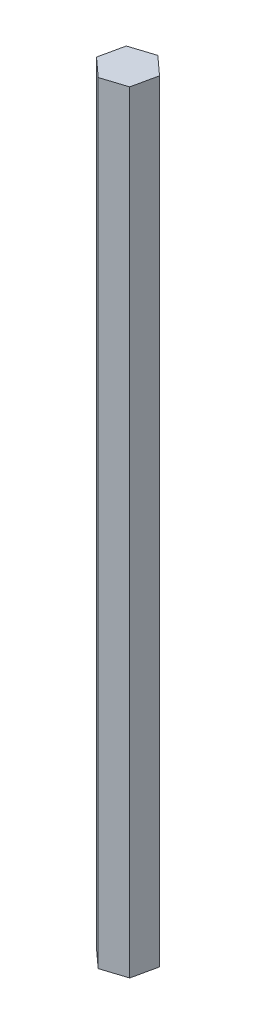
ISO-10303-21;
HEADER;
FILE_DESCRIPTION(('STEP AP214'),'2;1');
FILE_NAME('part.step','',(''),(''),'','','');
FILE_SCHEMA(('AUTOMOTIVE_DESIGN { 1 0 10303 214 1 1 1 1 }'));
ENDSEC;
DATA;
#1=APPLICATION_CONTEXT('core data for automotive mechanical design processes');
#2=APPLICATION_PROTOCOL_DEFINITION('international standard','automotive_design',2000,#1);
#3=PRODUCT_CONTEXT('',#1,'mechanical');
#4=PRODUCT('Part','Part','',(#3));
#5=PRODUCT_RELATED_PRODUCT_CATEGORY('part','',(#4));
#6=PRODUCT_DEFINITION_FORMATION('','',#4);
#7=PRODUCT_DEFINITION_CONTEXT('part definition',#1,'design');
#8=PRODUCT_DEFINITION('design','',#6,#7);
#9=PRODUCT_DEFINITION_SHAPE('','',#8);
#10=(LENGTH_UNIT() NAMED_UNIT(*) SI_UNIT(.MILLI.,.METRE.));
#11=(NAMED_UNIT(*) PLANE_ANGLE_UNIT() SI_UNIT($,.RADIAN.));
#12=(NAMED_UNIT(*) SI_UNIT($,.STERADIAN.) SOLID_ANGLE_UNIT());
#13=UNCERTAINTY_MEASURE_WITH_UNIT(LENGTH_MEASURE(1.E-05),#10,'distance_accuracy_value','');
#14=(GEOMETRIC_REPRESENTATION_CONTEXT(3) GLOBAL_UNCERTAINTY_ASSIGNED_CONTEXT((#13)) GLOBAL_UNIT_ASSIGNED_CONTEXT((#10,
#11,#12)) REPRESENTATION_CONTEXT('',''));
#15=CARTESIAN_POINT('',(0.,0.,0.));
#16=DIRECTION('',(0.,0.,1.));
#17=DIRECTION('',(1.,0.,0.));
#18=AXIS2_PLACEMENT_3D('',#15,#16,#17);
#19=CARTESIAN_POINT('',(-0.61182187926995,127.,2.82117126764399));
#20=DIRECTION('',(-0.305094633460301,0.,-0.952322038300976));
#21=DIRECTION('',(-0.952322038300976,0.,0.305094633460301));
#22=AXIS2_PLACEMENT_3D('',#19,#20,#21);
#23=PLANE('',#22);
#24=DIRECTION('',(-0.952322038300976,0.,0.305094633460301));
#25=VECTOR('',#24,1.);
#26=CARTESIAN_POINT('',(-0.61182187926995,38.1,2.82117126764399));
#27=LINE('',#26,#25);
#28=CARTESIAN_POINT('',(2.13729504657146,38.1,1.94043892386091));
#29=VERTEX_POINT('',#28);
#30=CARTESIAN_POINT('',(-0.61182187926995,38.1,2.82117126764399));
#31=VERTEX_POINT('',#30);
#32=EDGE_CURVE('E53',#29,#31,#27,.T.);
#33=ORIENTED_EDGE('',*,*,#32,.F.);
#34=DIRECTION('',(0.,-1.,0.));
#35=VECTOR('',#34,1.);
#36=CARTESIAN_POINT('',(2.13729504657146,127.,1.94043892386091));
#37=LINE('',#36,#35);
#38=CARTESIAN_POINT('',(2.13729504657146,127.,1.94043892386091));
#39=VERTEX_POINT('',#38);
#40=EDGE_CURVE('E47',#39,#29,#37,.T.);
#41=ORIENTED_EDGE('',*,*,#40,.F.);
#42=DIRECTION('',(0.952322038300976,0.,-0.305094633460301));
#43=VECTOR('',#42,1.);
#44=CARTESIAN_POINT('',(-0.61182187926995,127.,2.82117126764399));
#45=LINE('',#44,#43);
#46=CARTESIAN_POINT('',(-0.61182187926995,127.,2.82117126764399));
#47=VERTEX_POINT('',#46);
#48=EDGE_CURVE('E135',#47,#39,#45,.T.);
#49=ORIENTED_EDGE('',*,*,#48,.F.);
#50=DIRECTION('',(0.,-1.,0.));
#51=VECTOR('',#50,1.);
#52=CARTESIAN_POINT('',(-0.61182187926995,127.,2.82117126764399));
#53=LINE('',#52,#51);
#54=EDGE_CURVE('E109',#47,#31,#53,.T.);
#55=ORIENTED_EDGE('',*,*,#54,.T.);
#56=EDGE_LOOP('',(#33,#41,#49,#55));
#57=FACE_BOUND('',#56,.T.);
#58=ADVANCED_FACE('F39',(#57),#23,.F.);
#59=CARTESIAN_POINT('',(2.13729504657146,127.,1.94043892386091));
#60=DIRECTION('',(-0.977282394482572,0.,-0.211941316015566));
#61=DIRECTION('',(-0.211941316015566,0.,0.977282394482572));
#62=AXIS2_PLACEMENT_3D('',#59,#60,#61);
#63=PLANE('',#62);
#64=DIRECTION('',(-0.211941316015566,0.,0.977282394482572));
#65=VECTOR('',#64,1.);
#66=CARTESIAN_POINT('',(2.13729504657146,38.1,1.94043892386091));
#67=LINE('',#66,#65);
#68=CARTESIAN_POINT('',(2.74911692584142,38.1,-0.880732343783076));
#69=VERTEX_POINT('',#68);
#70=EDGE_CURVE('E131',#69,#29,#67,.T.);
#71=ORIENTED_EDGE('',*,*,#70,.F.);
#72=DIRECTION('',(0.,-1.,0.));
#73=VECTOR('',#72,1.);
#74=CARTESIAN_POINT('',(2.74911692584142,127.,-0.880732343783076));
#75=LINE('',#74,#73);
#76=CARTESIAN_POINT('',(2.74911692584142,127.,-0.880732343783076));
#77=VERTEX_POINT('',#76);
#78=EDGE_CURVE('E121',#77,#69,#75,.T.);
#79=ORIENTED_EDGE('',*,*,#78,.F.);
#80=DIRECTION('',(0.211941316015566,0.,-0.977282394482572));
#81=VECTOR('',#80,1.);
#82=CARTESIAN_POINT('',(2.13729504657146,127.,1.94043892386091));
#83=LINE('',#82,#81);
#84=EDGE_CURVE('E132',#39,#77,#83,.T.);
#85=ORIENTED_EDGE('',*,*,#84,.F.);
#86=ORIENTED_EDGE('',*,*,#40,.T.);
#87=EDGE_LOOP('',(#71,#79,#85,#86));
#88=FACE_BOUND('',#87,.T.);
#89=ADVANCED_FACE('F129',(#88),#63,.F.);
#90=CARTESIAN_POINT('',(2.74911692584142,127.,-0.880732343783076));
#91=DIRECTION('',(-0.672187761022271,0.,0.74038072228541));
#92=DIRECTION('',(0.74038072228541,0.,0.672187761022271));
#93=AXIS2_PLACEMENT_3D('',#90,#91,#92);
#94=PLANE('',#93);
#95=DIRECTION('',(0.74038072228541,0.,0.672187761022271));
#96=VECTOR('',#95,1.);
#97=CARTESIAN_POINT('',(2.74911692584142,38.1,-0.880732343783076));
#98=LINE('',#97,#96);
#99=CARTESIAN_POINT('',(0.611821879269952,38.1,-2.82117126764399));
#100=VERTEX_POINT('',#99);
#101=EDGE_CURVE('E141',#100,#69,#98,.T.);
#102=ORIENTED_EDGE('',*,*,#101,.F.);
#103=DIRECTION('',(0.,-1.,0.));
#104=VECTOR('',#103,1.);
#105=CARTESIAN_POINT('',(0.611821879269952,127.,-2.82117126764399));
#106=LINE('',#105,#104);
#107=CARTESIAN_POINT('',(0.611821879269952,127.,-2.82117126764399));
#108=VERTEX_POINT('',#107);
#109=EDGE_CURVE('E113',#108,#100,#106,.T.);
#110=ORIENTED_EDGE('',*,*,#109,.F.);
#111=DIRECTION('',(-0.74038072228541,0.,-0.672187761022271));
#112=VECTOR('',#111,1.);
#113=CARTESIAN_POINT('',(2.74911692584142,127.,-0.880732343783076));
#114=LINE('',#113,#112);
#115=EDGE_CURVE('E147',#77,#108,#114,.T.);
#116=ORIENTED_EDGE('',*,*,#115,.F.);
#117=ORIENTED_EDGE('',*,*,#78,.T.);
#118=EDGE_LOOP('',(#102,#110,#116,#117));
#119=FACE_BOUND('',#118,.T.);
#120=ADVANCED_FACE('F167',(#119),#94,.F.);
#121=CARTESIAN_POINT('',(0.611821879269952,127.,-2.82117126764399));
#122=DIRECTION('',(0.305094633460301,0.,0.952322038300975));
#123=DIRECTION('',(0.952322038300976,0.,-0.305094633460301));
#124=AXIS2_PLACEMENT_3D('',#121,#122,#123);
#125=PLANE('',#124);
#126=DIRECTION('',(0.952322038300976,0.,-0.305094633460301));
#127=VECTOR('',#126,1.);
#128=CARTESIAN_POINT('',(0.611821879269952,38.1,-2.82117126764399));
#129=LINE('',#128,#127);
#130=CARTESIAN_POINT('',(-2.13729504657146,38.1,-1.94043892386091));
#131=VERTEX_POINT('',#130);
#132=EDGE_CURVE('E105',#131,#100,#129,.T.);
#133=ORIENTED_EDGE('',*,*,#132,.F.);
#134=DIRECTION('',(0.,-1.,0.));
#135=VECTOR('',#134,1.);
#136=CARTESIAN_POINT('',(-2.13729504657146,127.,-1.94043892386091));
#137=LINE('',#136,#135);
#138=CARTESIAN_POINT('',(-2.13729504657146,127.,-1.94043892386091));
#139=VERTEX_POINT('',#138);
#140=EDGE_CURVE('E103',#139,#131,#137,.T.);
#141=ORIENTED_EDGE('',*,*,#140,.F.);
#142=DIRECTION('',(-0.952322038300976,0.,0.305094633460301));
#143=VECTOR('',#142,1.);
#144=CARTESIAN_POINT('',(0.611821879269952,127.,-2.82117126764399));
#145=LINE('',#144,#143);
#146=EDGE_CURVE('E150',#108,#139,#145,.T.);
#147=ORIENTED_EDGE('',*,*,#146,.F.);
#148=ORIENTED_EDGE('',*,*,#109,.T.);
#149=EDGE_LOOP('',(#133,#141,#147,#148));
#150=FACE_BOUND('',#149,.T.);
#151=ADVANCED_FACE('F161',(#150),#125,.F.);
#152=CARTESIAN_POINT('',(-2.13729504657146,127.,-1.94043892386091));
#153=DIRECTION('',(0.977282394482573,0.,0.211941316015565));
#154=DIRECTION('',(0.211941316015565,0.,-0.977282394482573));
#155=AXIS2_PLACEMENT_3D('',#152,#153,#154);
#156=PLANE('',#155);
#157=DIRECTION('',(0.211941316015565,0.,-0.977282394482573));
#158=VECTOR('',#157,1.);
#159=CARTESIAN_POINT('',(-2.13729504657146,38.1,-1.94043892386091));
#160=LINE('',#159,#158);
#161=CARTESIAN_POINT('',(-2.74911692584141,38.1,0.88073234378308));
#162=VERTEX_POINT('',#161);
#163=EDGE_CURVE('E91',#162,#131,#160,.T.);
#164=ORIENTED_EDGE('',*,*,#163,.F.);
#165=DIRECTION('',(0.,-1.,0.));
#166=VECTOR('',#165,1.);
#167=CARTESIAN_POINT('',(-2.74911692584141,127.,0.88073234378308));
#168=LINE('',#167,#166);
#169=CARTESIAN_POINT('',(-2.74911692584141,127.,0.88073234378308));
#170=VERTEX_POINT('',#169);
#171=EDGE_CURVE('E101',#170,#162,#168,.T.);
#172=ORIENTED_EDGE('',*,*,#171,.F.);
#173=DIRECTION('',(-0.211941316015565,0.,0.977282394482572));
#174=VECTOR('',#173,1.);
#175=CARTESIAN_POINT('',(-2.13729504657146,127.,-1.94043892386091));
#176=LINE('',#175,#174);
#177=EDGE_CURVE('E153',#139,#170,#176,.T.);
#178=ORIENTED_EDGE('',*,*,#177,.F.);
#179=ORIENTED_EDGE('',*,*,#140,.T.);
#180=EDGE_LOOP('',(#164,#172,#178,#179));
#181=FACE_BOUND('',#180,.T.);
#182=ADVANCED_FACE('F99',(#181),#156,.F.);
#183=CARTESIAN_POINT('',(-2.74911692584141,127.,0.88073234378308));
#184=DIRECTION('',(0.672187761022271,0.,-0.74038072228541));
#185=DIRECTION('',(-0.740380722285411,0.,-0.672187761022271));
#186=AXIS2_PLACEMENT_3D('',#183,#184,#185);
#187=PLANE('',#186);
#188=DIRECTION('',(-0.740380722285411,0.,-0.672187761022271));
#189=VECTOR('',#188,1.);
#190=CARTESIAN_POINT('',(-2.74911692584141,38.1,0.88073234378308));
#191=LINE('',#190,#189);
#192=EDGE_CURVE('E11',#31,#162,#191,.T.);
#193=ORIENTED_EDGE('',*,*,#192,.F.);
#194=ORIENTED_EDGE('',*,*,#54,.F.);
#195=DIRECTION('',(0.740380722285411,0.,0.672187761022271));
#196=VECTOR('',#195,1.);
#197=CARTESIAN_POINT('',(-2.74911692584141,127.,0.88073234378308));
#198=LINE('',#197,#196);
#199=EDGE_CURVE('E61',#170,#47,#198,.T.);
#200=ORIENTED_EDGE('',*,*,#199,.F.);
#201=ORIENTED_EDGE('',*,*,#171,.T.);
#202=EDGE_LOOP('',(#193,#194,#200,#201));
#203=FACE_BOUND('',#202,.T.);
#204=ADVANCED_FACE('F107',(#203),#187,.F.);
#205=CARTESIAN_POINT('',(0.,127.,0.));
#206=DIRECTION('',(0.,1.,0.));
#207=DIRECTION('',(0.,0.,1.));
#208=AXIS2_PLACEMENT_3D('',#205,#206,#207);
#209=PLANE('',#208);
#210=ORIENTED_EDGE('',*,*,#48,.T.);
#211=ORIENTED_EDGE('',*,*,#84,.T.);
#212=ORIENTED_EDGE('',*,*,#115,.T.);
#213=ORIENTED_EDGE('',*,*,#146,.T.);
#214=ORIENTED_EDGE('',*,*,#177,.T.);
#215=ORIENTED_EDGE('',*,*,#199,.T.);
#216=EDGE_LOOP('',(#210,#211,#212,#213,#214,#215));
#217=FACE_BOUND('',#216,.T.);
#218=ADVANCED_FACE('F156',(#217),#209,.T.);
#219=CARTESIAN_POINT('',(0.,38.1,0.));
#220=DIRECTION('',(0.,-1.,0.));
#221=DIRECTION('',(0.,0.,-1.));
#222=AXIS2_PLACEMENT_3D('',#219,#220,#221);
#223=PLANE('',#222);
#224=ORIENTED_EDGE('',*,*,#32,.T.);
#225=ORIENTED_EDGE('',*,*,#192,.T.);
#226=ORIENTED_EDGE('',*,*,#163,.T.);
#227=ORIENTED_EDGE('',*,*,#132,.T.);
#228=ORIENTED_EDGE('',*,*,#101,.T.);
#229=ORIENTED_EDGE('',*,*,#70,.T.);
#230=EDGE_LOOP('',(#224,#225,#226,#227,#228,#229));
#231=FACE_BOUND('',#230,.T.);
#232=ADVANCED_FACE('F90',(#231),#223,.T.);
#233=CLOSED_SHELL('',(#58,#89,#120,#151,#182,#204,#218,#232));
#234=MANIFOLD_SOLID_BREP('B2',#233);
#235=ADVANCED_BREP_SHAPE_REPRESENTATION('',(#18,#234),#14);
#236=SHAPE_DEFINITION_REPRESENTATION(#9,#235);
ENDSEC;
END-ISO-10303-21;
